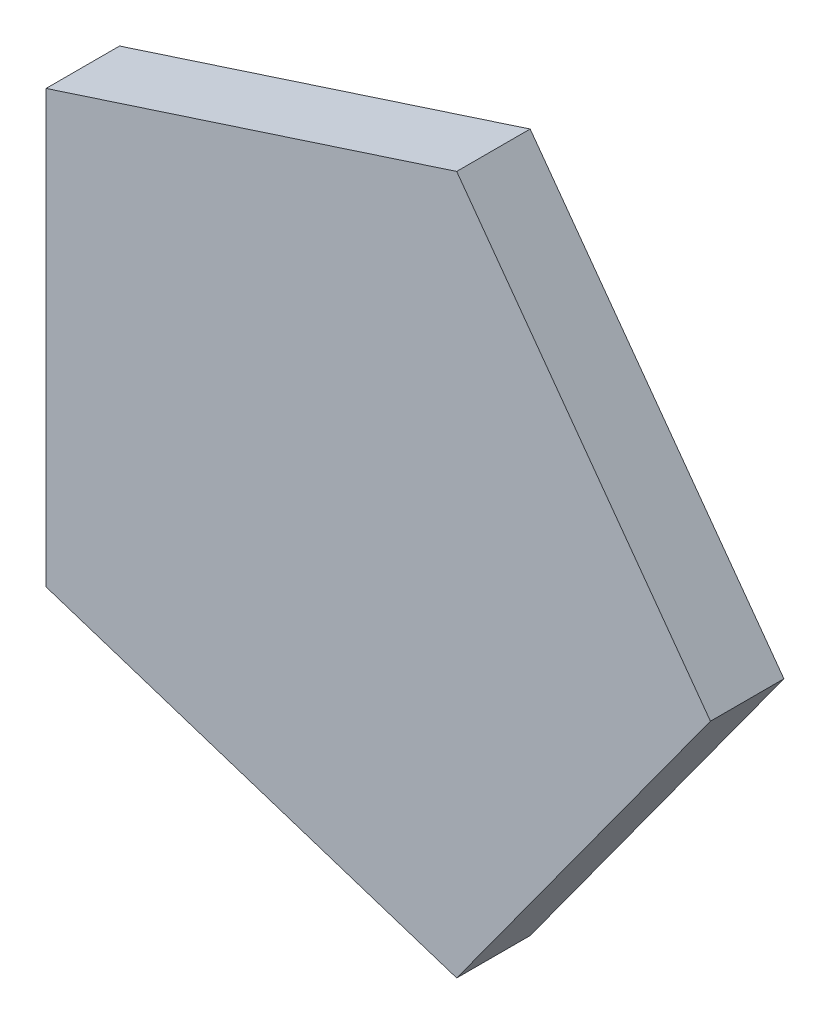
ISO-10303-21;
HEADER;
FILE_DESCRIPTION(('STEP AP214'),'2;1');
FILE_NAME('part.step','',(''),(''),'','','');
FILE_SCHEMA(('AUTOMOTIVE_DESIGN { 1 0 10303 214 1 1 1 1 }'));
ENDSEC;
DATA;
#1=APPLICATION_CONTEXT('core data for automotive mechanical design processes');
#2=APPLICATION_PROTOCOL_DEFINITION('international standard','automotive_design',2000,#1);
#3=PRODUCT_CONTEXT('',#1,'mechanical');
#4=PRODUCT('Part','Part','',(#3));
#5=PRODUCT_RELATED_PRODUCT_CATEGORY('part','',(#4));
#6=PRODUCT_DEFINITION_FORMATION('','',#4);
#7=PRODUCT_DEFINITION_CONTEXT('part definition',#1,'design');
#8=PRODUCT_DEFINITION('design','',#6,#7);
#9=PRODUCT_DEFINITION_SHAPE('','',#8);
#10=(LENGTH_UNIT() NAMED_UNIT(*) SI_UNIT(.MILLI.,.METRE.));
#11=(NAMED_UNIT(*) PLANE_ANGLE_UNIT() SI_UNIT($,.RADIAN.));
#12=(NAMED_UNIT(*) SI_UNIT($,.STERADIAN.) SOLID_ANGLE_UNIT());
#13=UNCERTAINTY_MEASURE_WITH_UNIT(LENGTH_MEASURE(1.E-05),#10,'distance_accuracy_value','');
#14=(GEOMETRIC_REPRESENTATION_CONTEXT(3) GLOBAL_UNCERTAINTY_ASSIGNED_CONTEXT((#13)) GLOBAL_UNIT_ASSIGNED_CONTEXT((#10,
#11,#12)) REPRESENTATION_CONTEXT('',''));
#15=CARTESIAN_POINT('',(0.,0.,0.));
#16=DIRECTION('',(0.,0.,1.));
#17=DIRECTION('',(1.,0.,0.));
#18=AXIS2_PLACEMENT_3D('',#15,#16,#17);
#19=CARTESIAN_POINT('',(30.9016994374948,-95.1056516295153,20.));
#20=DIRECTION('',(-0.809016994374948,0.587785252292472,0.));
#21=DIRECTION('',(-0.587785252292472,-0.809016994374948,0.));
#22=AXIS2_PLACEMENT_3D('',#19,#20,#21);
#23=PLANE('',#22);
#24=DIRECTION('',(0.587785252292472,0.809016994374948,0.));
#25=VECTOR('',#24,1.);
#26=CARTESIAN_POINT('',(30.9016994374948,-95.1056516295153,0.));
#27=LINE('',#26,#25);
#28=CARTESIAN_POINT('',(30.9016994374948,-95.1056516295153,0.));
#29=VERTEX_POINT('',#28);
#30=CARTESIAN_POINT('',(99.9999999999999,0.,0.));
#31=VERTEX_POINT('',#30);
#32=EDGE_CURVE('E115',#29,#31,#27,.T.);
#33=ORIENTED_EDGE('',*,*,#32,.T.);
#34=DIRECTION('',(0.,0.,-1.));
#35=VECTOR('',#34,1.);
#36=CARTESIAN_POINT('',(99.9999999999999,0.,20.));
#37=LINE('',#36,#35);
#38=CARTESIAN_POINT('',(99.9999999999999,0.,20.));
#39=VERTEX_POINT('',#38);
#40=EDGE_CURVE('E11',#39,#31,#37,.T.);
#41=ORIENTED_EDGE('',*,*,#40,.F.);
#42=DIRECTION('',(0.587785252292472,0.809016994374948,0.));
#43=VECTOR('',#42,1.);
#44=CARTESIAN_POINT('',(30.9016994374948,-95.1056516295153,20.));
#45=LINE('',#44,#43);
#46=CARTESIAN_POINT('',(30.9016994374948,-95.1056516295153,20.));
#47=VERTEX_POINT('',#46);
#48=EDGE_CURVE('E123',#47,#39,#45,.T.);
#49=ORIENTED_EDGE('',*,*,#48,.F.);
#50=DIRECTION('',(0.,0.,-1.));
#51=VECTOR('',#50,1.);
#52=CARTESIAN_POINT('',(30.9016994374948,-95.1056516295153,20.));
#53=LINE('',#52,#51);
#54=EDGE_CURVE('E111',#47,#29,#53,.T.);
#55=ORIENTED_EDGE('',*,*,#54,.T.);
#56=EDGE_LOOP('',(#33,#41,#49,#55));
#57=FACE_BOUND('',#56,.T.);
#58=ADVANCED_FACE('F41',(#57),#23,.F.);
#59=CARTESIAN_POINT('',(99.9999999999999,0.,20.));
#60=DIRECTION('',(-0.809016994374947,-0.587785252292474,0.));
#61=DIRECTION('',(0.587785252292474,-0.809016994374947,0.));
#62=AXIS2_PLACEMENT_3D('',#59,#60,#61);
#63=PLANE('',#62);
#64=DIRECTION('',(-0.587785252292474,0.809016994374947,0.));
#65=VECTOR('',#64,1.);
#66=CARTESIAN_POINT('',(99.9999999999999,0.,0.));
#67=LINE('',#66,#65);
#68=CARTESIAN_POINT('',(30.9016994374946,95.1056516295154,0.));
#69=VERTEX_POINT('',#68);
#70=EDGE_CURVE('E118',#31,#69,#67,.T.);
#71=ORIENTED_EDGE('',*,*,#70,.T.);
#72=DIRECTION('',(0.,0.,-1.));
#73=VECTOR('',#72,1.);
#74=CARTESIAN_POINT('',(30.9016994374946,95.1056516295154,20.));
#75=LINE('',#74,#73);
#76=CARTESIAN_POINT('',(30.9016994374946,95.1056516295154,20.));
#77=VERTEX_POINT('',#76);
#78=EDGE_CURVE('E49',#77,#69,#75,.T.);
#79=ORIENTED_EDGE('',*,*,#78,.F.);
#80=DIRECTION('',(-0.587785252292474,0.809016994374947,0.));
#81=VECTOR('',#80,1.);
#82=CARTESIAN_POINT('',(99.9999999999999,0.,20.));
#83=LINE('',#82,#81);
#84=EDGE_CURVE('E91',#39,#77,#83,.T.);
#85=ORIENTED_EDGE('',*,*,#84,.F.);
#86=ORIENTED_EDGE('',*,*,#40,.T.);
#87=EDGE_LOOP('',(#71,#79,#85,#86));
#88=FACE_BOUND('',#87,.T.);
#89=ADVANCED_FACE('F142',(#88),#63,.F.);
#90=CARTESIAN_POINT('',(30.9016994374946,95.1056516295154,20.));
#91=DIRECTION('',(0.309016994374949,-0.951056516295153,0.));
#92=DIRECTION('',(0.951056516295153,0.309016994374949,0.));
#93=AXIS2_PLACEMENT_3D('',#90,#91,#92);
#94=PLANE('',#93);
#95=DIRECTION('',(-0.951056516295153,-0.309016994374949,0.));
#96=VECTOR('',#95,1.);
#97=CARTESIAN_POINT('',(30.9016994374946,95.1056516295154,0.));
#98=LINE('',#97,#96);
#99=CARTESIAN_POINT('',(-80.9016994374948,58.7785252292472,0.));
#100=VERTEX_POINT('',#99);
#101=EDGE_CURVE('E106',#69,#100,#98,.T.);
#102=ORIENTED_EDGE('',*,*,#101,.T.);
#103=DIRECTION('',(0.,0.,-1.));
#104=VECTOR('',#103,1.);
#105=CARTESIAN_POINT('',(-80.9016994374948,58.7785252292472,20.));
#106=LINE('',#105,#104);
#107=CARTESIAN_POINT('',(-80.9016994374948,58.7785252292472,20.));
#108=VERTEX_POINT('',#107);
#109=EDGE_CURVE('E103',#108,#100,#106,.T.);
#110=ORIENTED_EDGE('',*,*,#109,.F.);
#111=DIRECTION('',(-0.951056516295153,-0.309016994374949,0.));
#112=VECTOR('',#111,1.);
#113=CARTESIAN_POINT('',(30.9016994374946,95.1056516295154,20.));
#114=LINE('',#113,#112);
#115=EDGE_CURVE('E95',#77,#108,#114,.T.);
#116=ORIENTED_EDGE('',*,*,#115,.F.);
#117=ORIENTED_EDGE('',*,*,#78,.T.);
#118=EDGE_LOOP('',(#102,#110,#116,#117));
#119=FACE_BOUND('',#118,.T.);
#120=ADVANCED_FACE('F104',(#119),#94,.F.);
#121=CARTESIAN_POINT('',(-80.9016994374948,58.7785252292472,20.));
#122=DIRECTION('',(1.,0.,0.));
#123=DIRECTION('',(0.,1.,0.));
#124=AXIS2_PLACEMENT_3D('',#121,#122,#123);
#125=PLANE('',#124);
#126=DIRECTION('',(0.,-1.,0.));
#127=VECTOR('',#126,1.);
#128=CARTESIAN_POINT('',(-80.9016994374948,58.7785252292472,0.));
#129=LINE('',#128,#127);
#130=CARTESIAN_POINT('',(-80.9016994374946,-58.7785252292474,0.));
#131=VERTEX_POINT('',#130);
#132=EDGE_CURVE('E77',#100,#131,#129,.T.);
#133=ORIENTED_EDGE('',*,*,#132,.T.);
#134=DIRECTION('',(0.,0.,-1.));
#135=VECTOR('',#134,1.);
#136=CARTESIAN_POINT('',(-80.9016994374946,-58.7785252292474,20.));
#137=LINE('',#136,#135);
#138=CARTESIAN_POINT('',(-80.9016994374946,-58.7785252292474,20.));
#139=VERTEX_POINT('',#138);
#140=EDGE_CURVE('E107',#139,#131,#137,.T.);
#141=ORIENTED_EDGE('',*,*,#140,.F.);
#142=DIRECTION('',(0.,-1.,0.));
#143=VECTOR('',#142,1.);
#144=CARTESIAN_POINT('',(-80.9016994374948,58.7785252292472,20.));
#145=LINE('',#144,#143);
#146=EDGE_CURVE('E99',#108,#139,#145,.T.);
#147=ORIENTED_EDGE('',*,*,#146,.F.);
#148=ORIENTED_EDGE('',*,*,#109,.T.);
#149=EDGE_LOOP('',(#133,#141,#147,#148));
#150=FACE_BOUND('',#149,.T.);
#151=ADVANCED_FACE('F109',(#150),#125,.F.);
#152=CARTESIAN_POINT('',(-80.9016994374946,-58.7785252292474,20.));
#153=DIRECTION('',(0.309016994374946,0.951056516295154,0.));
#154=DIRECTION('',(-0.951056516295154,0.309016994374946,0.));
#155=AXIS2_PLACEMENT_3D('',#152,#153,#154);
#156=PLANE('',#155);
#157=DIRECTION('',(0.951056516295154,-0.309016994374946,0.));
#158=VECTOR('',#157,1.);
#159=CARTESIAN_POINT('',(-80.9016994374946,-58.7785252292474,0.));
#160=LINE('',#159,#158);
#161=EDGE_CURVE('E83',#131,#29,#160,.T.);
#162=ORIENTED_EDGE('',*,*,#161,.T.);
#163=ORIENTED_EDGE('',*,*,#54,.F.);
#164=DIRECTION('',(0.951056516295154,-0.309016994374946,0.));
#165=VECTOR('',#164,1.);
#166=CARTESIAN_POINT('',(-80.9016994374946,-58.7785252292474,20.));
#167=LINE('',#166,#165);
#168=EDGE_CURVE('E57',#139,#47,#167,.T.);
#169=ORIENTED_EDGE('',*,*,#168,.F.);
#170=ORIENTED_EDGE('',*,*,#140,.T.);
#171=EDGE_LOOP('',(#162,#163,#169,#170));
#172=FACE_BOUND('',#171,.T.);
#173=ADVANCED_FACE('F131',(#172),#156,.F.);
#174=CARTESIAN_POINT('',(0.,0.,20.));
#175=DIRECTION('',(0.,0.,1.));
#176=DIRECTION('',(1.,0.,0.));
#177=AXIS2_PLACEMENT_3D('',#174,#175,#176);
#178=PLANE('',#177);
#179=ORIENTED_EDGE('',*,*,#48,.T.);
#180=ORIENTED_EDGE('',*,*,#84,.T.);
#181=ORIENTED_EDGE('',*,*,#115,.T.);
#182=ORIENTED_EDGE('',*,*,#146,.T.);
#183=ORIENTED_EDGE('',*,*,#168,.T.);
#184=EDGE_LOOP('',(#179,#180,#181,#182,#183));
#185=FACE_BOUND('',#184,.T.);
#186=ADVANCED_FACE('F97',(#185),#178,.T.);
#187=CARTESIAN_POINT('',(0.,0.,0.));
#188=DIRECTION('',(0.,0.,1.));
#189=DIRECTION('',(1.,0.,0.));
#190=AXIS2_PLACEMENT_3D('',#187,#188,#189);
#191=PLANE('',#190);
#192=ORIENTED_EDGE('',*,*,#32,.F.);
#193=ORIENTED_EDGE('',*,*,#161,.F.);
#194=ORIENTED_EDGE('',*,*,#132,.F.);
#195=ORIENTED_EDGE('',*,*,#101,.F.);
#196=ORIENTED_EDGE('',*,*,#70,.F.);
#197=EDGE_LOOP('',(#192,#193,#194,#195,#196));
#198=FACE_BOUND('',#197,.T.);
#199=ADVANCED_FACE('F127',(#198),#191,.F.);
#200=CLOSED_SHELL('',(#58,#89,#120,#151,#173,#186,#199));
#201=MANIFOLD_SOLID_BREP('B2',#200);
#202=ADVANCED_BREP_SHAPE_REPRESENTATION('',(#18,#201),#14);
#203=SHAPE_DEFINITION_REPRESENTATION(#9,#202);
ENDSEC;
END-ISO-10303-21;
